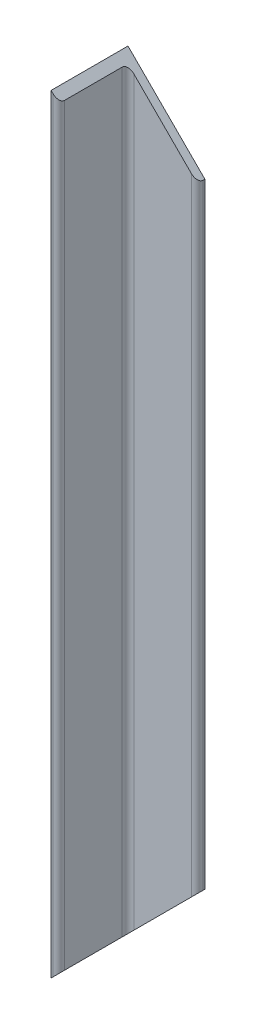
ISO-10303-21;
HEADER;
FILE_DESCRIPTION(('STEP AP214'),'2;1');
FILE_NAME('part.step','',(''),(''),'','','');
FILE_SCHEMA(('AUTOMOTIVE_DESIGN { 1 0 10303 214 1 1 1 1 }'));
ENDSEC;
DATA;
#1=APPLICATION_CONTEXT('core data for automotive mechanical design processes');
#2=APPLICATION_PROTOCOL_DEFINITION('international standard','automotive_design',2000,#1);
#3=PRODUCT_CONTEXT('',#1,'mechanical');
#4=PRODUCT('Part','Part','',(#3));
#5=PRODUCT_RELATED_PRODUCT_CATEGORY('part','',(#4));
#6=PRODUCT_DEFINITION_FORMATION('','',#4);
#7=PRODUCT_DEFINITION_CONTEXT('part definition',#1,'design');
#8=PRODUCT_DEFINITION('design','',#6,#7);
#9=PRODUCT_DEFINITION_SHAPE('','',#8);
#10=(LENGTH_UNIT() NAMED_UNIT(*) SI_UNIT(.MILLI.,.METRE.));
#11=(NAMED_UNIT(*) PLANE_ANGLE_UNIT() SI_UNIT($,.RADIAN.));
#12=(NAMED_UNIT(*) SI_UNIT($,.STERADIAN.) SOLID_ANGLE_UNIT());
#13=UNCERTAINTY_MEASURE_WITH_UNIT(LENGTH_MEASURE(1.E-05),#10,'distance_accuracy_value','');
#14=(GEOMETRIC_REPRESENTATION_CONTEXT(3) GLOBAL_UNCERTAINTY_ASSIGNED_CONTEXT((#13)) GLOBAL_UNIT_ASSIGNED_CONTEXT((#10,
#11,#12)) REPRESENTATION_CONTEXT('',''));
#15=CARTESIAN_POINT('',(0.,0.,0.));
#16=DIRECTION('',(0.,0.,1.));
#17=DIRECTION('',(1.,0.,0.));
#18=AXIS2_PLACEMENT_3D('',#15,#16,#17);
#19=CARTESIAN_POINT('',(-27.4998721449561,400.,-28.2131532770167));
#20=DIRECTION('',(-1.,0.,0.));
#21=DIRECTION('',(0.,0.,1.));
#22=AXIS2_PLACEMENT_3D('',#19,#20,#21);
#23=PLANE('',#22);
#24=DIRECTION('',(0.,-1.,0.));
#25=VECTOR('',#24,1.);
#26=CARTESIAN_POINT('',(-27.4998721449561,400.,-28.2131532770167));
#27=LINE('',#26,#25);
#28=CARTESIAN_POINT('',(-27.4998721449561,360.,-28.2131532770166));
#29=VERTEX_POINT('',#28);
#30=CARTESIAN_POINT('',(-27.4998721449561,40.,-28.2131532770166));
#31=VERTEX_POINT('',#30);
#32=EDGE_CURVE('E105',#29,#31,#27,.T.);
#33=ORIENTED_EDGE('',*,*,#32,.T.);
#34=DIRECTION('',(0.,0.,-1.));
#35=VECTOR('',#34,1.);
#36=CARTESIAN_POINT('',(-27.4998721449561,40.,10.7868467229834));
#37=LINE('',#36,#35);
#38=CARTESIAN_POINT('',(-27.4998721449561,40.,-29.2131532770166));
#39=VERTEX_POINT('',#38);
#40=EDGE_CURVE('E171',#31,#39,#37,.T.);
#41=ORIENTED_EDGE('',*,*,#40,.T.);
#42=DIRECTION('',(0.,-1.,0.));
#43=VECTOR('',#42,1.);
#44=CARTESIAN_POINT('',(-27.4998721449561,400.,-29.2131532770166));
#45=LINE('',#44,#43);
#46=CARTESIAN_POINT('',(-27.4998721449561,360.,-29.2131532770166));
#47=VERTEX_POINT('',#46);
#48=EDGE_CURVE('E11',#47,#39,#45,.T.);
#49=ORIENTED_EDGE('',*,*,#48,.F.);
#50=DIRECTION('',(0.,0.,-1.));
#51=VECTOR('',#50,1.);
#52=CARTESIAN_POINT('',(-27.4998721449561,360.,10.7868467229834));
#53=LINE('',#52,#51);
#54=EDGE_CURVE('E116',#29,#47,#53,.T.);
#55=ORIENTED_EDGE('',*,*,#54,.F.);
#56=EDGE_LOOP('',(#33,#41,#49,#55));
#57=FACE_BOUND('',#56,.T.);
#58=ADVANCED_FACE('F33',(#57),#23,.F.);
#59=CARTESIAN_POINT('',(-27.4998721449561,400.,-29.2131532770166));
#60=DIRECTION('',(0.,0.,1.));
#61=DIRECTION('',(1.,0.,0.));
#62=AXIS2_PLACEMENT_3D('',#59,#60,#61);
#63=PLANE('',#62);
#64=ORIENTED_EDGE('',*,*,#48,.T.);
#65=DIRECTION('',(-0.707106781186548,-0.707106781186548,0.));
#66=VECTOR('',#65,1.);
#67=CARTESIAN_POINT('',(152.500127855044,220.,-29.2131532770167));
#68=LINE('',#67,#66);
#69=CARTESIAN_POINT('',(-67.4998721449561,0.,-29.2131532770166));
#70=VERTEX_POINT('',#69);
#71=EDGE_CURVE('E153',#39,#70,#68,.T.);
#72=ORIENTED_EDGE('',*,*,#71,.T.);
#73=DIRECTION('',(0.,-1.,0.));
#74=VECTOR('',#73,1.);
#75=CARTESIAN_POINT('',(-67.4998721449561,400.,-29.2131532770166));
#76=LINE('',#75,#74);
#77=CARTESIAN_POINT('',(-67.4998721449561,400.,-29.2131532770166));
#78=VERTEX_POINT('',#77);
#79=EDGE_CURVE('E41',#78,#70,#76,.T.);
#80=ORIENTED_EDGE('',*,*,#79,.F.);
#81=DIRECTION('',(0.707106781186547,-0.707106781186548,0.));
#82=VECTOR('',#81,1.);
#83=CARTESIAN_POINT('',(-47.4998721449561,380.,-29.2131532770166));
#84=LINE('',#83,#82);
#85=EDGE_CURVE('E47',#78,#47,#84,.T.);
#86=ORIENTED_EDGE('',*,*,#85,.T.);
#87=EDGE_LOOP('',(#64,#72,#80,#86));
#88=FACE_BOUND('',#87,.T.);
#89=ADVANCED_FACE('F196',(#88),#63,.F.);
#90=CARTESIAN_POINT('',(-67.4998721449561,400.,-29.2131532770166));
#91=DIRECTION('',(1.,0.,0.));
#92=DIRECTION('',(0.,0.,-1.));
#93=AXIS2_PLACEMENT_3D('',#90,#91,#92);
#94=PLANE('',#93);
#95=DIRECTION('',(0.,0.,1.));
#96=VECTOR('',#95,1.);
#97=CARTESIAN_POINT('',(-67.4998721449561,0.,-29.2131532770166));
#98=LINE('',#97,#96);
#99=CARTESIAN_POINT('',(-67.4998721449561,0.,10.7868467229834));
#100=VERTEX_POINT('',#99);
#101=EDGE_CURVE('E106',#70,#100,#98,.T.);
#102=ORIENTED_EDGE('',*,*,#101,.T.);
#103=DIRECTION('',(0.,-1.,0.));
#104=VECTOR('',#103,1.);
#105=CARTESIAN_POINT('',(-67.4998721449561,400.,10.7868467229834));
#106=LINE('',#105,#104);
#107=CARTESIAN_POINT('',(-67.4998721449561,400.,10.7868467229834));
#108=VERTEX_POINT('',#107);
#109=EDGE_CURVE('E113',#108,#100,#106,.T.);
#110=ORIENTED_EDGE('',*,*,#109,.F.);
#111=DIRECTION('',(0.,0.,1.));
#112=VECTOR('',#111,1.);
#113=CARTESIAN_POINT('',(-67.4998721449561,400.,-29.2131532770166));
#114=LINE('',#113,#112);
#115=EDGE_CURVE('E97',#78,#108,#114,.T.);
#116=ORIENTED_EDGE('',*,*,#115,.F.);
#117=ORIENTED_EDGE('',*,*,#79,.T.);
#118=EDGE_LOOP('',(#102,#110,#116,#117));
#119=FACE_BOUND('',#118,.T.);
#120=ADVANCED_FACE('F119',(#119),#94,.F.);
#121=CARTESIAN_POINT('',(-67.4998721449561,400.,10.7868467229834));
#122=DIRECTION('',(0.,0.,-1.));
#123=DIRECTION('',(-1.,0.,0.));
#124=AXIS2_PLACEMENT_3D('',#121,#122,#123);
#125=PLANE('',#124);
#126=ORIENTED_EDGE('',*,*,#109,.T.);
#127=DIRECTION('',(0.707106781186548,0.707106781186548,0.));
#128=VECTOR('',#127,1.);
#129=CARTESIAN_POINT('',(-67.4998721449561,0.,10.7868467229834));
#130=LINE('',#129,#128);
#131=CARTESIAN_POINT('',(-66.4998721449561,1.00000000000005,10.7868467229834));
#132=VERTEX_POINT('',#131);
#133=EDGE_CURVE('E172',#100,#132,#130,.T.);
#134=ORIENTED_EDGE('',*,*,#133,.T.);
#135=DIRECTION('',(0.,-1.,0.));
#136=VECTOR('',#135,1.);
#137=CARTESIAN_POINT('',(-66.4998721449561,400.,10.7868467229834));
#138=LINE('',#137,#136);
#139=CARTESIAN_POINT('',(-66.4998721449561,399.,10.7868467229834));
#140=VERTEX_POINT('',#139);
#141=EDGE_CURVE('E115',#140,#132,#138,.T.);
#142=ORIENTED_EDGE('',*,*,#141,.F.);
#143=DIRECTION('',(-0.707106781186547,0.707106781186548,0.));
#144=VECTOR('',#143,1.);
#145=CARTESIAN_POINT('',(-67.4998721449561,400.,10.7868467229834));
#146=LINE('',#145,#144);
#147=EDGE_CURVE('E100',#140,#108,#146,.T.);
#148=ORIENTED_EDGE('',*,*,#147,.T.);
#149=EDGE_LOOP('',(#126,#134,#142,#148));
#150=FACE_BOUND('',#149,.T.);
#151=ADVANCED_FACE('F111',(#150),#125,.F.);
#152=CARTESIAN_POINT('',(-66.4998721449561,400.,7.78684672298336));
#153=DIRECTION('',(0.,-1.,0.));
#154=DIRECTION('',(0.,0.,-1.));
#155=AXIS2_PLACEMENT_3D('',#152,#153,#154);
#156=CYLINDRICAL_SURFACE('',#155,3.);
#157=ORIENTED_EDGE('',*,*,#141,.T.);
#158=CARTESIAN_POINT('',(-66.4998721449561,1.,7.78684672298336));
#159=DIRECTION('',(-0.707106781186548,0.707106781186548,0.));
#160=DIRECTION('',(-0.707106781186548,-0.707106781186548,0.));
#161=AXIS2_PLACEMENT_3D('',#158,#159,#160);
#162=ELLIPSE('',#161,4.24264068711929,3.);
#163=CARTESIAN_POINT('',(-63.4998721449561,3.99999999999995,7.78684672298334));
#164=VERTEX_POINT('',#163);
#165=EDGE_CURVE('E156',#132,#164,#162,.T.);
#166=ORIENTED_EDGE('',*,*,#165,.T.);
#167=DIRECTION('',(0.,-1.,0.));
#168=VECTOR('',#167,1.);
#169=CARTESIAN_POINT('',(-63.4998721449561,400.,7.78684672298334));
#170=LINE('',#169,#168);
#171=CARTESIAN_POINT('',(-63.4998721449561,396.,7.78684672298334));
#172=VERTEX_POINT('',#171);
#173=EDGE_CURVE('E121',#172,#164,#170,.T.);
#174=ORIENTED_EDGE('',*,*,#173,.F.);
#175=CARTESIAN_POINT('',(-66.4998721449561,399.,7.78684672298336));
#176=DIRECTION('',(-0.707106781186548,-0.707106781186547,0.));
#177=DIRECTION('',(0.707106781186547,-0.707106781186548,0.));
#178=AXIS2_PLACEMENT_3D('',#175,#176,#177);
#179=ELLIPSE('',#178,4.24264068711929,3.);
#180=EDGE_CURVE('E139',#172,#140,#179,.T.);
#181=ORIENTED_EDGE('',*,*,#180,.T.);
#182=EDGE_LOOP('',(#157,#166,#174,#181));
#183=FACE_BOUND('',#182,.T.);
#184=ADVANCED_FACE('F178',(#183),#156,.T.);
#185=CARTESIAN_POINT('',(-63.4998721449561,400.,7.78684672298334));
#186=DIRECTION('',(-1.,0.,0.));
#187=DIRECTION('',(0.,0.,1.));
#188=AXIS2_PLACEMENT_3D('',#185,#186,#187);
#189=PLANE('',#188);
#190=ORIENTED_EDGE('',*,*,#173,.T.);
#191=DIRECTION('',(0.,0.,-1.));
#192=VECTOR('',#191,1.);
#193=CARTESIAN_POINT('',(-63.4998721449561,3.99999999999995,7.7868467229833));
#194=LINE('',#193,#192);
#195=CARTESIAN_POINT('',(-63.4998721449561,3.99999999999995,-22.2131532770166));
#196=VERTEX_POINT('',#195);
#197=EDGE_CURVE('E159',#164,#196,#194,.T.);
#198=ORIENTED_EDGE('',*,*,#197,.T.);
#199=DIRECTION('',(0.,-1.,0.));
#200=VECTOR('',#199,1.);
#201=CARTESIAN_POINT('',(-63.4998721449561,400.,-22.2131532770166));
#202=LINE('',#201,#200);
#203=CARTESIAN_POINT('',(-63.4998721449561,396.,-22.2131532770166));
#204=VERTEX_POINT('',#203);
#205=EDGE_CURVE('E126',#204,#196,#202,.T.);
#206=ORIENTED_EDGE('',*,*,#205,.F.);
#207=DIRECTION('',(0.,0.,1.));
#208=VECTOR('',#207,1.);
#209=CARTESIAN_POINT('',(-63.4998721449561,396.,7.78684672298334));
#210=LINE('',#209,#208);
#211=EDGE_CURVE('E141',#204,#172,#210,.T.);
#212=ORIENTED_EDGE('',*,*,#211,.T.);
#213=EDGE_LOOP('',(#190,#198,#206,#212));
#214=FACE_BOUND('',#213,.T.);
#215=ADVANCED_FACE('F182',(#214),#189,.F.);
#216=CARTESIAN_POINT('',(-60.4998721449561,400.,-22.2131532770166));
#217=DIRECTION('',(0.,-1.,0.));
#218=DIRECTION('',(0.,0.,-1.));
#219=AXIS2_PLACEMENT_3D('',#216,#217,#218);
#220=CYLINDRICAL_SURFACE('',#219,3.);
#221=ORIENTED_EDGE('',*,*,#205,.T.);
#222=CARTESIAN_POINT('',(-60.4998721449561,7.00000000000001,-22.2131532770166));
#223=DIRECTION('',(-0.707106781186548,0.707106781186548,0.));
#224=DIRECTION('',(-0.707106781186548,-0.707106781186548,0.));
#225=AXIS2_PLACEMENT_3D('',#222,#223,#224);
#226=ELLIPSE('',#225,4.24264068711929,3.);
#227=CARTESIAN_POINT('',(-60.4998721449561,7.00000000000001,-25.2131532770166));
#228=VERTEX_POINT('',#227);
#229=EDGE_CURVE('E162',#196,#228,#226,.F.);
#230=ORIENTED_EDGE('',*,*,#229,.T.);
#231=DIRECTION('',(0.,-1.,0.));
#232=VECTOR('',#231,1.);
#233=CARTESIAN_POINT('',(-60.4998721449561,400.,-25.2131532770166));
#234=LINE('',#233,#232);
#235=CARTESIAN_POINT('',(-60.4998721449561,393.,-25.2131532770166));
#236=VERTEX_POINT('',#235);
#237=EDGE_CURVE('E129',#236,#228,#234,.T.);
#238=ORIENTED_EDGE('',*,*,#237,.F.);
#239=CARTESIAN_POINT('',(-60.4998721449561,393.,-22.2131532770166));
#240=DIRECTION('',(-0.707106781186548,-0.707106781186547,0.));
#241=DIRECTION('',(0.707106781186547,-0.707106781186548,0.));
#242=AXIS2_PLACEMENT_3D('',#239,#240,#241);
#243=ELLIPSE('',#242,4.24264068711929,3.);
#244=EDGE_CURVE('E144',#236,#204,#243,.F.);
#245=ORIENTED_EDGE('',*,*,#244,.T.);
#246=EDGE_LOOP('',(#221,#230,#238,#245));
#247=FACE_BOUND('',#246,.T.);
#248=ADVANCED_FACE('F184',(#247),#220,.F.);
#249=CARTESIAN_POINT('',(-60.4998721449561,400.,-25.2131532770166));
#250=DIRECTION('',(0.,0.,-1.));
#251=DIRECTION('',(-1.,0.,0.));
#252=AXIS2_PLACEMENT_3D('',#249,#250,#251);
#253=PLANE('',#252);
#254=ORIENTED_EDGE('',*,*,#237,.T.);
#255=DIRECTION('',(0.707106781186548,0.707106781186548,0.));
#256=VECTOR('',#255,1.);
#257=CARTESIAN_POINT('',(136.000127855044,203.5,-25.2131532770166));
#258=LINE('',#257,#256);
#259=CARTESIAN_POINT('',(-30.4998721449561,37.,-25.2131532770166));
#260=VERTEX_POINT('',#259);
#261=EDGE_CURVE('E165',#228,#260,#258,.T.);
#262=ORIENTED_EDGE('',*,*,#261,.T.);
#263=DIRECTION('',(0.,-1.,0.));
#264=VECTOR('',#263,1.);
#265=CARTESIAN_POINT('',(-30.4998721449561,400.,-25.2131532770166));
#266=LINE('',#265,#264);
#267=CARTESIAN_POINT('',(-30.4998721449561,363.,-25.2131532770166));
#268=VERTEX_POINT('',#267);
#269=EDGE_CURVE('E132',#268,#260,#266,.T.);
#270=ORIENTED_EDGE('',*,*,#269,.F.);
#271=DIRECTION('',(-0.707106781186547,0.707106781186548,0.));
#272=VECTOR('',#271,1.);
#273=CARTESIAN_POINT('',(-63.9998721449561,396.5,-25.2131532770166));
#274=LINE('',#273,#272);
#275=EDGE_CURVE('E147',#268,#236,#274,.T.);
#276=ORIENTED_EDGE('',*,*,#275,.T.);
#277=EDGE_LOOP('',(#254,#262,#270,#276));
#278=FACE_BOUND('',#277,.T.);
#279=ADVANCED_FACE('F188',(#278),#253,.F.);
#280=CARTESIAN_POINT('',(-30.4998721449561,400.,-28.2131532770166));
#281=DIRECTION('',(0.,-1.,0.));
#282=DIRECTION('',(0.,0.,-1.));
#283=AXIS2_PLACEMENT_3D('',#280,#281,#282);
#284=CYLINDRICAL_SURFACE('',#283,3.);
#285=ORIENTED_EDGE('',*,*,#269,.T.);
#286=CARTESIAN_POINT('',(-30.4998721449561,37.,-28.2131532770166));
#287=DIRECTION('',(-0.707106781186548,0.707106781186548,0.));
#288=DIRECTION('',(-0.707106781186548,-0.707106781186548,0.));
#289=AXIS2_PLACEMENT_3D('',#286,#287,#288);
#290=ELLIPSE('',#289,4.24264068711929,3.);
#291=EDGE_CURVE('E168',#260,#31,#290,.T.);
#292=ORIENTED_EDGE('',*,*,#291,.T.);
#293=ORIENTED_EDGE('',*,*,#32,.F.);
#294=CARTESIAN_POINT('',(-30.4998721449561,363.,-28.2131532770166));
#295=DIRECTION('',(-0.707106781186548,-0.707106781186547,0.));
#296=DIRECTION('',(0.707106781186547,-0.707106781186548,0.));
#297=AXIS2_PLACEMENT_3D('',#294,#295,#296);
#298=ELLIPSE('',#297,4.24264068711929,3.);
#299=EDGE_CURVE('E150',#29,#268,#298,.T.);
#300=ORIENTED_EDGE('',*,*,#299,.T.);
#301=EDGE_LOOP('',(#285,#292,#293,#300));
#302=FACE_BOUND('',#301,.T.);
#303=ADVANCED_FACE('F190',(#302),#284,.T.);
#304=CARTESIAN_POINT('',(-67.4998721449561,0.,10.7868467229834));
#305=DIRECTION('',(-0.707106781186548,0.707106781186548,0.));
#306=DIRECTION('',(-0.707106781186548,-0.707106781186548,0.));
#307=AXIS2_PLACEMENT_3D('',#304,#305,#306);
#308=PLANE('',#307);
#309=ORIENTED_EDGE('',*,*,#40,.F.);
#310=ORIENTED_EDGE('',*,*,#291,.F.);
#311=ORIENTED_EDGE('',*,*,#261,.F.);
#312=ORIENTED_EDGE('',*,*,#229,.F.);
#313=ORIENTED_EDGE('',*,*,#197,.F.);
#314=ORIENTED_EDGE('',*,*,#165,.F.);
#315=ORIENTED_EDGE('',*,*,#133,.F.);
#316=ORIENTED_EDGE('',*,*,#101,.F.);
#317=ORIENTED_EDGE('',*,*,#71,.F.);
#318=EDGE_LOOP('',(#309,#310,#311,#312,#313,#314,#315,#316,#317));
#319=FACE_BOUND('',#318,.T.);
#320=ADVANCED_FACE('F197',(#319),#308,.F.);
#321=CARTESIAN_POINT('',(-67.4998721449561,400.,10.7868467229834));
#322=DIRECTION('',(-0.707106781186548,-0.707106781186547,0.));
#323=DIRECTION('',(0.707106781186547,-0.707106781186548,0.));
#324=AXIS2_PLACEMENT_3D('',#321,#322,#323);
#325=PLANE('',#324);
#326=ORIENTED_EDGE('',*,*,#115,.T.);
#327=ORIENTED_EDGE('',*,*,#147,.F.);
#328=ORIENTED_EDGE('',*,*,#180,.F.);
#329=ORIENTED_EDGE('',*,*,#211,.F.);
#330=ORIENTED_EDGE('',*,*,#244,.F.);
#331=ORIENTED_EDGE('',*,*,#275,.F.);
#332=ORIENTED_EDGE('',*,*,#299,.F.);
#333=ORIENTED_EDGE('',*,*,#54,.T.);
#334=ORIENTED_EDGE('',*,*,#85,.F.);
#335=EDGE_LOOP('',(#326,#327,#328,#329,#330,#331,#332,#333,#334));
#336=FACE_BOUND('',#335,.T.);
#337=ADVANCED_FACE('F99',(#336),#325,.F.);
#338=CLOSED_SHELL('',(#58,#89,#120,#151,#184,#215,#248,#279,#303,#320,#337));
#339=MANIFOLD_SOLID_BREP('B2',#338);
#340=ADVANCED_BREP_SHAPE_REPRESENTATION('',(#18,#339),#14);
#341=SHAPE_DEFINITION_REPRESENTATION(#9,#340);
ENDSEC;
END-ISO-10303-21;
